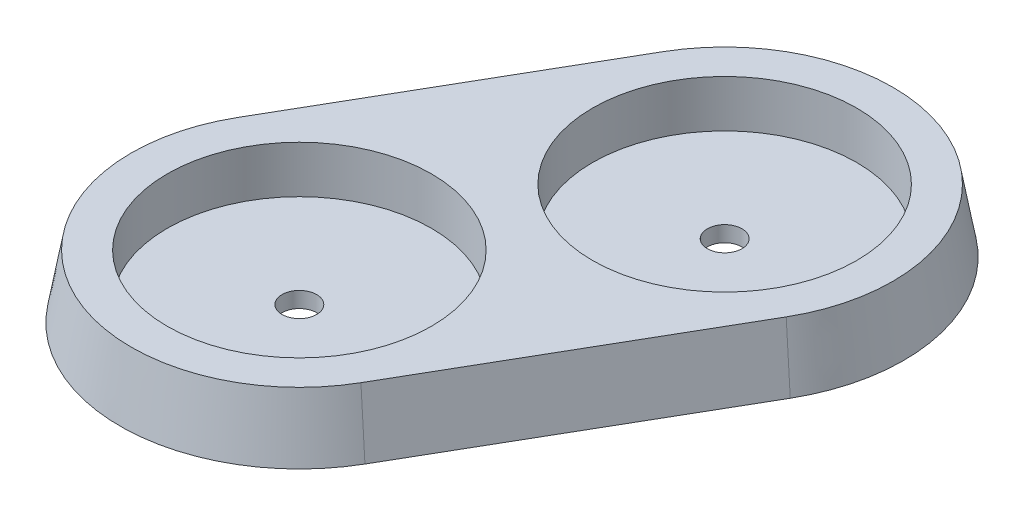
ISO-10303-21;
HEADER;
FILE_DESCRIPTION(('STEP AP214'),'2;1');
FILE_NAME('part.step','',(''),(''),'','','');
FILE_SCHEMA(('AUTOMOTIVE_DESIGN { 1 0 10303 214 1 1 1 1 }'));
ENDSEC;
DATA;
#1=APPLICATION_CONTEXT('core data for automotive mechanical design processes');
#2=APPLICATION_PROTOCOL_DEFINITION('international standard','automotive_design',2000,#1);
#3=PRODUCT_CONTEXT('',#1,'mechanical');
#4=PRODUCT('Part','Part','',(#3));
#5=PRODUCT_RELATED_PRODUCT_CATEGORY('part','',(#4));
#6=PRODUCT_DEFINITION_FORMATION('','',#4);
#7=PRODUCT_DEFINITION_CONTEXT('part definition',#1,'design');
#8=PRODUCT_DEFINITION('design','',#6,#7);
#9=PRODUCT_DEFINITION_SHAPE('','',#8);
#10=(LENGTH_UNIT() NAMED_UNIT(*) SI_UNIT(.MILLI.,.METRE.));
#11=(NAMED_UNIT(*) PLANE_ANGLE_UNIT() SI_UNIT($,.RADIAN.));
#12=(NAMED_UNIT(*) SI_UNIT($,.STERADIAN.) SOLID_ANGLE_UNIT());
#13=UNCERTAINTY_MEASURE_WITH_UNIT(LENGTH_MEASURE(1.E-05),#10,'distance_accuracy_value','');
#14=(GEOMETRIC_REPRESENTATION_CONTEXT(3) GLOBAL_UNCERTAINTY_ASSIGNED_CONTEXT((#13)) GLOBAL_UNIT_ASSIGNED_CONTEXT((#10,
#11,#12)) REPRESENTATION_CONTEXT('',''));
#15=CARTESIAN_POINT('',(0.,0.,0.));
#16=DIRECTION('',(0.,0.,1.));
#17=DIRECTION('',(1.,0.,0.));
#18=AXIS2_PLACEMENT_3D('',#15,#16,#17);
#19=CARTESIAN_POINT('',(0.,0.,0.));
#20=DIRECTION('',(0.,1.,0.));
#21=DIRECTION('',(0.,0.,1.));
#22=AXIS2_PLACEMENT_3D('',#19,#20,#21);
#23=CYLINDRICAL_SURFACE('',#22,1.1);
#24=CARTESIAN_POINT('',(0.,0.,0.));
#25=DIRECTION('',(0.,1.,0.));
#26=DIRECTION('',(0.,0.,1.));
#27=AXIS2_PLACEMENT_3D('',#24,#25,#26);
#28=CIRCLE('',#27,1.1);
#29=CARTESIAN_POINT('',(0.,0.,1.1));
#30=VERTEX_POINT('',#29);
#31=EDGE_CURVE('E121',#30,#30,#28,.T.);
#32=ORIENTED_EDGE('',*,*,#31,.F.);
#33=EDGE_LOOP('',(#32));
#34=FACE_BOUND('',#33,.T.);
#35=CARTESIAN_POINT('',(0.,1.,0.));
#36=DIRECTION('',(0.,1.,0.));
#37=DIRECTION('',(0.,0.,1.));
#38=AXIS2_PLACEMENT_3D('',#35,#36,#37);
#39=CIRCLE('',#38,1.1);
#40=CARTESIAN_POINT('',(0.,1.,1.1));
#41=VERTEX_POINT('',#40);
#42=EDGE_CURVE('E205',#41,#41,#39,.T.);
#43=ORIENTED_EDGE('',*,*,#42,.T.);
#44=EDGE_LOOP('',(#43));
#45=FACE_BOUND('',#44,.T.);
#46=ADVANCED_FACE('F53',(#34,#45),#23,.F.);
#47=CARTESIAN_POINT('',(-9.90000000000008,0.,17.1473029949318));
#48=DIRECTION('',(0.,1.,0.));
#49=DIRECTION('',(0.,0.,1.));
#50=AXIS2_PLACEMENT_3D('',#47,#48,#49);
#51=CYLINDRICAL_SURFACE('',#50,1.1);
#52=CARTESIAN_POINT('',(-9.90000000000008,0.,17.1473029949318));
#53=DIRECTION('',(0.,1.,0.));
#54=DIRECTION('',(0.,0.,1.));
#55=AXIS2_PLACEMENT_3D('',#52,#53,#54);
#56=CIRCLE('',#55,1.1);
#57=CARTESIAN_POINT('',(-9.90000000000008,0.,18.2473029949318));
#58=VERTEX_POINT('',#57);
#59=EDGE_CURVE('E117',#58,#58,#56,.T.);
#60=ORIENTED_EDGE('',*,*,#59,.F.);
#61=EDGE_LOOP('',(#60));
#62=FACE_BOUND('',#61,.T.);
#63=CARTESIAN_POINT('',(-9.90000000000008,1.,17.1473029949318));
#64=DIRECTION('',(0.,1.,0.));
#65=DIRECTION('',(0.,0.,1.));
#66=AXIS2_PLACEMENT_3D('',#63,#64,#65);
#67=CIRCLE('',#66,1.1);
#68=CARTESIAN_POINT('',(-9.90000000000008,1.,18.2473029949318));
#69=VERTEX_POINT('',#68);
#70=EDGE_CURVE('E191',#69,#69,#67,.T.);
#71=ORIENTED_EDGE('',*,*,#70,.T.);
#72=EDGE_LOOP('',(#71));
#73=FACE_BOUND('',#72,.T.);
#74=ADVANCED_FACE('F162',(#62,#73),#51,.F.);
#75=CARTESIAN_POINT('',(-9.87268960314258,0.,-5.70000000000005));
#76=DIRECTION('',(-0.852868531952441,0.173648177666931,-0.492403876506108));
#77=DIRECTION('',(-0.500000000000004,0.,0.866025403784436));
#78=AXIS2_PLACEMENT_3D('',#75,#76,#77);
#79=PLANE('',#78);
#80=DIRECTION('',(-0.500000000000004,0.,0.866025403784436));
#81=VECTOR('',#80,1.);
#82=CARTESIAN_POINT('',(-9.87268960314258,0.,-5.70000000000005));
#83=LINE('',#82,#81);
#84=CARTESIAN_POINT('',(-9.87268960314258,0.,-5.70000000000005));
#85=VERTEX_POINT('',#84);
#86=CARTESIAN_POINT('',(-19.7726896031427,0.,11.4473029949318));
#87=VERTEX_POINT('',#86);
#88=EDGE_CURVE('E103',#85,#87,#83,.T.);
#89=ORIENTED_EDGE('',*,*,#88,.T.);
#90=DIRECTION('',(-0.150383733180435,-0.984807753012208,-0.0868240888334661));
#91=VECTOR('',#90,1.);
#92=CARTESIAN_POINT('',(-19.7726896031427,0.,11.4473029949318));
#93=LINE('',#92,#91);
#94=CARTESIAN_POINT('',(-19.1618750244781,4.,11.7999569563487));
#95=VERTEX_POINT('',#94);
#96=EDGE_CURVE('E12',#95,#87,#93,.T.);
#97=ORIENTED_EDGE('',*,*,#96,.F.);
#98=DIRECTION('',(0.500000000000004,0.,-0.866025403784436));
#99=VECTOR('',#98,1.);
#100=CARTESIAN_POINT('',(-9.26187502447802,4.,-5.34734603858311));
#101=LINE('',#100,#99);
#102=CARTESIAN_POINT('',(-9.26187502447802,4.,-5.34734603858311));
#103=VERTEX_POINT('',#102);
#104=EDGE_CURVE('E129',#103,#95,#101,.F.);
#105=ORIENTED_EDGE('',*,*,#104,.F.);
#106=DIRECTION('',(-0.150383733180435,-0.984807753012208,-0.0868240888334661));
#107=VECTOR('',#106,1.);
#108=CARTESIAN_POINT('',(-9.87268960314258,0.,-5.70000000000005));
#109=LINE('',#108,#107);
#110=EDGE_CURVE('E115',#103,#85,#109,.T.);
#111=ORIENTED_EDGE('',*,*,#110,.T.);
#112=EDGE_LOOP('',(#89,#97,#105,#111));
#113=FACE_BOUND('',#112,.T.);
#114=ADVANCED_FACE('F114',(#113),#79,.T.);
#115=CARTESIAN_POINT('',(-9.90000000000008,0.,17.1473029949318));
#116=DIRECTION('',(0.,-1.,0.));
#117=DIRECTION('',(0.,0.,1.));
#118=AXIS2_PLACEMENT_3D('',#115,#116,#117);
#119=CONICAL_SURFACE('',#118,11.4,0.174532925199433);
#120=CARTESIAN_POINT('',(-9.90000000000008,0.,17.1473029949318));
#121=DIRECTION('',(0.,1.,0.));
#122=DIRECTION('',(0.,0.,1.));
#123=AXIS2_PLACEMENT_3D('',#120,#121,#122);
#124=CIRCLE('',#123,11.4);
#125=CARTESIAN_POINT('',(-0.0273103968575087,0.,22.8473029949319));
#126=VERTEX_POINT('',#125);
#127=EDGE_CURVE('E99',#87,#126,#124,.T.);
#128=ORIENTED_EDGE('',*,*,#127,.T.);
#129=DIRECTION('',(0.150383733180435,-0.984807753012208,0.0868240888334661));
#130=VECTOR('',#129,1.);
#131=CARTESIAN_POINT('',(-0.0273103968575079,0.,22.8473029949319));
#132=LINE('',#131,#130);
#133=CARTESIAN_POINT('',(-0.638124975522065,4.,22.494649033515));
#134=VERTEX_POINT('',#133);
#135=EDGE_CURVE('E63',#134,#126,#132,.T.);
#136=ORIENTED_EDGE('',*,*,#135,.F.);
#137=CARTESIAN_POINT('',(-9.90000000000008,4.,17.1473029949318));
#138=DIRECTION('',(0.,1.,0.));
#139=DIRECTION('',(0.,0.,1.));
#140=AXIS2_PLACEMENT_3D('',#137,#138,#139);
#141=CIRCLE('',#140,10.6946920771661);
#142=EDGE_CURVE('E110',#95,#134,#141,.T.);
#143=ORIENTED_EDGE('',*,*,#142,.F.);
#144=ORIENTED_EDGE('',*,*,#96,.T.);
#145=EDGE_LOOP('',(#128,#136,#143,#144));
#146=FACE_BOUND('',#145,.T.);
#147=ADVANCED_FACE('F55',(#146),#119,.T.);
#148=CARTESIAN_POINT('',(9.87268960314258,0.,5.70000000000005));
#149=DIRECTION('',(0.852868531952441,0.173648177666931,0.492403876506108));
#150=DIRECTION('',(0.500000000000004,0.,-0.866025403784436));
#151=AXIS2_PLACEMENT_3D('',#148,#149,#150);
#152=PLANE('',#151);
#153=DIRECTION('',(-0.500000000000004,0.,0.866025403784436));
#154=VECTOR('',#153,1.);
#155=CARTESIAN_POINT('',(9.87268960314258,0.,5.70000000000005));
#156=LINE('',#155,#154);
#157=CARTESIAN_POINT('',(9.87268960314258,0.,5.70000000000005));
#158=VERTEX_POINT('',#157);
#159=EDGE_CURVE('E104',#158,#126,#156,.T.);
#160=ORIENTED_EDGE('',*,*,#159,.F.);
#161=DIRECTION('',(0.150383733180435,-0.984807753012208,0.0868240888334661));
#162=VECTOR('',#161,1.);
#163=CARTESIAN_POINT('',(9.87268960314258,0.,5.70000000000004));
#164=LINE('',#163,#162);
#165=CARTESIAN_POINT('',(9.26187502447802,4.,5.34734603858311));
#166=VERTEX_POINT('',#165);
#167=EDGE_CURVE('E78',#166,#158,#164,.T.);
#168=ORIENTED_EDGE('',*,*,#167,.F.);
#169=DIRECTION('',(-0.500000000000004,0.,0.866025403784436));
#170=VECTOR('',#169,1.);
#171=CARTESIAN_POINT('',(9.26187502447802,4.,5.34734603858312));
#172=LINE('',#171,#170);
#173=EDGE_CURVE('E140',#166,#134,#172,.T.);
#174=ORIENTED_EDGE('',*,*,#173,.T.);
#175=ORIENTED_EDGE('',*,*,#135,.T.);
#176=EDGE_LOOP('',(#160,#168,#174,#175));
#177=FACE_BOUND('',#176,.T.);
#178=ADVANCED_FACE('F143',(#177),#152,.T.);
#179=CARTESIAN_POINT('',(0.,0.,0.));
#180=DIRECTION('',(0.,-1.,0.));
#181=DIRECTION('',(0.,0.,1.));
#182=AXIS2_PLACEMENT_3D('',#179,#180,#181);
#183=CONICAL_SURFACE('',#182,11.4,0.174532925199433);
#184=CARTESIAN_POINT('',(0.,0.,0.));
#185=DIRECTION('',(0.,1.,0.));
#186=DIRECTION('',(0.,0.,1.));
#187=AXIS2_PLACEMENT_3D('',#184,#185,#186);
#188=CIRCLE('',#187,11.4);
#189=EDGE_CURVE('E127',#158,#85,#188,.T.);
#190=ORIENTED_EDGE('',*,*,#189,.T.);
#191=ORIENTED_EDGE('',*,*,#110,.F.);
#192=CARTESIAN_POINT('',(0.,4.,0.));
#193=DIRECTION('',(0.,1.,0.));
#194=DIRECTION('',(0.,0.,1.));
#195=AXIS2_PLACEMENT_3D('',#192,#193,#194);
#196=CIRCLE('',#195,10.6946920771661);
#197=EDGE_CURVE('E57',#166,#103,#196,.T.);
#198=ORIENTED_EDGE('',*,*,#197,.F.);
#199=ORIENTED_EDGE('',*,*,#167,.T.);
#200=EDGE_LOOP('',(#190,#191,#198,#199));
#201=FACE_BOUND('',#200,.T.);
#202=ADVANCED_FACE('F146',(#201),#183,.T.);
#203=CARTESIAN_POINT('',(0.,4.,0.));
#204=DIRECTION('',(0.,1.,0.));
#205=DIRECTION('',(0.,0.,1.));
#206=AXIS2_PLACEMENT_3D('',#203,#204,#205);
#207=PLANE('',#206);
#208=CARTESIAN_POINT('',(-9.90000000000008,4.,17.1473029949318));
#209=DIRECTION('',(0.,1.,0.));
#210=DIRECTION('',(0.,0.,1.));
#211=AXIS2_PLACEMENT_3D('',#208,#209,#210);
#212=CIRCLE('',#211,8.4);
#213=CARTESIAN_POINT('',(-9.90000000000008,4.,25.5473029949318));
#214=VERTEX_POINT('',#213);
#215=EDGE_CURVE('E196',#214,#214,#212,.T.);
#216=ORIENTED_EDGE('',*,*,#215,.F.);
#217=EDGE_LOOP('',(#216));
#218=FACE_BOUND('',#217,.T.);
#219=CARTESIAN_POINT('',(0.,4.,0.));
#220=DIRECTION('',(0.,1.,0.));
#221=DIRECTION('',(0.,0.,1.));
#222=AXIS2_PLACEMENT_3D('',#219,#220,#221);
#223=CIRCLE('',#222,8.4);
#224=CARTESIAN_POINT('',(0.,4.,8.4));
#225=VERTEX_POINT('',#224);
#226=EDGE_CURVE('E209',#225,#225,#223,.T.);
#227=ORIENTED_EDGE('',*,*,#226,.F.);
#228=EDGE_LOOP('',(#227));
#229=FACE_BOUND('',#228,.T.);
#230=ORIENTED_EDGE('',*,*,#104,.T.);
#231=ORIENTED_EDGE('',*,*,#142,.T.);
#232=ORIENTED_EDGE('',*,*,#173,.F.);
#233=ORIENTED_EDGE('',*,*,#197,.T.);
#234=EDGE_LOOP('',(#230,#231,#232,#233));
#235=FACE_BOUND('',#234,.T.);
#236=ADVANCED_FACE('F144',(#218,#229,#235),#207,.T.);
#237=CARTESIAN_POINT('',(0.,0.,0.));
#238=DIRECTION('',(0.,1.,0.));
#239=DIRECTION('',(0.,0.,1.));
#240=AXIS2_PLACEMENT_3D('',#237,#238,#239);
#241=PLANE('',#240);
#242=ORIENTED_EDGE('',*,*,#59,.T.);
#243=EDGE_LOOP('',(#242));
#244=FACE_BOUND('',#243,.T.);
#245=ORIENTED_EDGE('',*,*,#31,.T.);
#246=EDGE_LOOP('',(#245));
#247=FACE_BOUND('',#246,.T.);
#248=ORIENTED_EDGE('',*,*,#88,.F.);
#249=ORIENTED_EDGE('',*,*,#189,.F.);
#250=ORIENTED_EDGE('',*,*,#159,.T.);
#251=ORIENTED_EDGE('',*,*,#127,.F.);
#252=EDGE_LOOP('',(#248,#249,#250,#251));
#253=FACE_BOUND('',#252,.T.);
#254=ADVANCED_FACE('F100',(#244,#247,#253),#241,.F.);
#255=CARTESIAN_POINT('',(-9.90000000000008,1.,17.1473029949318));
#256=DIRECTION('',(0.,1.,0.));
#257=DIRECTION('',(0.,0.,1.));
#258=AXIS2_PLACEMENT_3D('',#255,#256,#257);
#259=CYLINDRICAL_SURFACE('',#258,8.4);
#260=CARTESIAN_POINT('',(-9.90000000000008,1.,17.1473029949318));
#261=DIRECTION('',(0.,1.,0.));
#262=DIRECTION('',(0.,0.,1.));
#263=AXIS2_PLACEMENT_3D('',#260,#261,#262);
#264=CIRCLE('',#263,8.4);
#265=CARTESIAN_POINT('',(-9.90000000000008,1.,25.5473029949318));
#266=VERTEX_POINT('',#265);
#267=EDGE_CURVE('E194',#266,#266,#264,.T.);
#268=ORIENTED_EDGE('',*,*,#267,.F.);
#269=EDGE_LOOP('',(#268));
#270=FACE_BOUND('',#269,.T.);
#271=ORIENTED_EDGE('',*,*,#215,.T.);
#272=EDGE_LOOP('',(#271));
#273=FACE_BOUND('',#272,.T.);
#274=ADVANCED_FACE('F153',(#270,#273),#259,.F.);
#275=CARTESIAN_POINT('',(-9.90000000000008,1.,17.1473029949318));
#276=DIRECTION('',(0.,1.,0.));
#277=DIRECTION('',(0.,0.,1.));
#278=AXIS2_PLACEMENT_3D('',#275,#276,#277);
#279=PLANE('',#278);
#280=ORIENTED_EDGE('',*,*,#70,.F.);
#281=EDGE_LOOP('',(#280));
#282=FACE_BOUND('',#281,.T.);
#283=ORIENTED_EDGE('',*,*,#267,.T.);
#284=EDGE_LOOP('',(#283));
#285=FACE_BOUND('',#284,.T.);
#286=ADVANCED_FACE('F176',(#282,#285),#279,.T.);
#287=CARTESIAN_POINT('',(0.,1.,0.));
#288=DIRECTION('',(0.,1.,0.));
#289=DIRECTION('',(0.,0.,1.));
#290=AXIS2_PLACEMENT_3D('',#287,#288,#289);
#291=CYLINDRICAL_SURFACE('',#290,8.4);
#292=CARTESIAN_POINT('',(0.,1.,0.));
#293=DIRECTION('',(0.,1.,0.));
#294=DIRECTION('',(0.,0.,1.));
#295=AXIS2_PLACEMENT_3D('',#292,#293,#294);
#296=CIRCLE('',#295,8.4);
#297=CARTESIAN_POINT('',(0.,1.,8.4));
#298=VERTEX_POINT('',#297);
#299=EDGE_CURVE('E210',#298,#298,#296,.T.);
#300=ORIENTED_EDGE('',*,*,#299,.F.);
#301=EDGE_LOOP('',(#300));
#302=FACE_BOUND('',#301,.T.);
#303=ORIENTED_EDGE('',*,*,#226,.T.);
#304=EDGE_LOOP('',(#303));
#305=FACE_BOUND('',#304,.T.);
#306=ADVANCED_FACE('F172',(#302,#305),#291,.F.);
#307=CARTESIAN_POINT('',(0.,1.,0.));
#308=DIRECTION('',(0.,1.,0.));
#309=DIRECTION('',(0.,0.,1.));
#310=AXIS2_PLACEMENT_3D('',#307,#308,#309);
#311=PLANE('',#310);
#312=ORIENTED_EDGE('',*,*,#42,.F.);
#313=EDGE_LOOP('',(#312));
#314=FACE_BOUND('',#313,.T.);
#315=ORIENTED_EDGE('',*,*,#299,.T.);
#316=EDGE_LOOP('',(#315));
#317=FACE_BOUND('',#316,.T.);
#318=ADVANCED_FACE('F175',(#314,#317),#311,.T.);
#319=CLOSED_SHELL('',(#46,#74,#114,#147,#178,#202,#236,#254,#274,#286,#306,#318));
#320=MANIFOLD_SOLID_BREP('B2',#319);
#321=ADVANCED_BREP_SHAPE_REPRESENTATION('',(#18,#320),#14);
#322=SHAPE_DEFINITION_REPRESENTATION(#9,#321);
ENDSEC;
END-ISO-10303-21;
